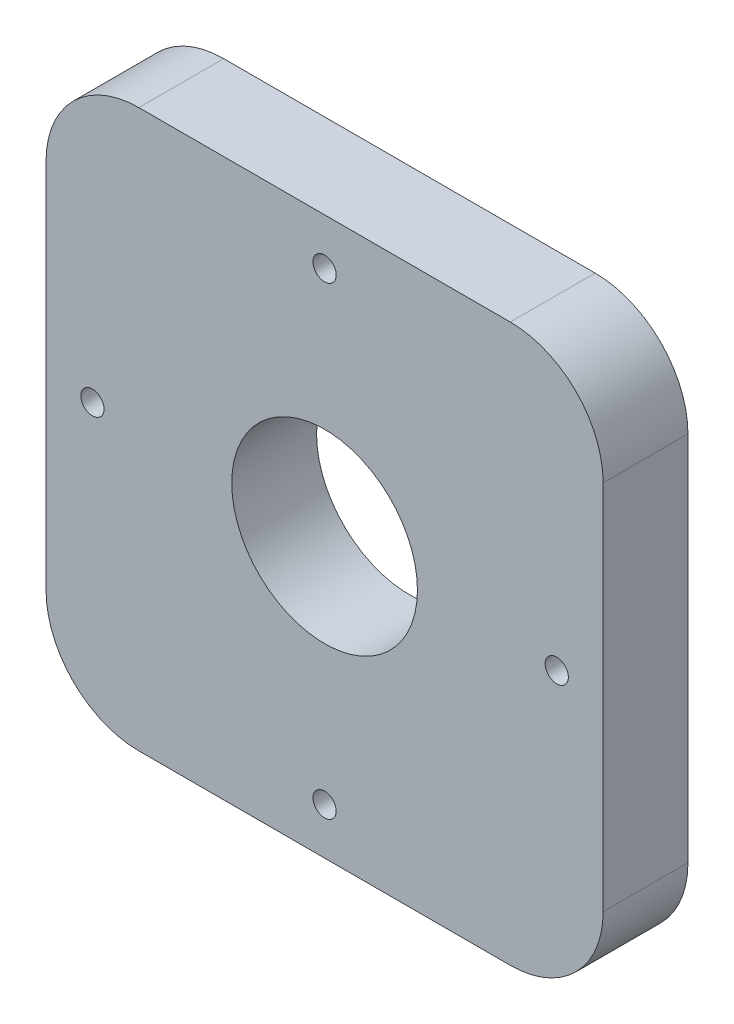
ISO-10303-21;
HEADER;
FILE_DESCRIPTION(('STEP AP214'),'2;1');
FILE_NAME('part.step','',(''),(''),'','','');
FILE_SCHEMA(('AUTOMOTIVE_DESIGN { 1 0 10303 214 1 1 1 1 }'));
ENDSEC;
DATA;
#1=APPLICATION_CONTEXT('core data for automotive mechanical design processes');
#2=APPLICATION_PROTOCOL_DEFINITION('international standard','automotive_design',2000,#1);
#3=PRODUCT_CONTEXT('',#1,'mechanical');
#4=PRODUCT('Part','Part','',(#3));
#5=PRODUCT_RELATED_PRODUCT_CATEGORY('part','',(#4));
#6=PRODUCT_DEFINITION_FORMATION('','',#4);
#7=PRODUCT_DEFINITION_CONTEXT('part definition',#1,'design');
#8=PRODUCT_DEFINITION('design','',#6,#7);
#9=PRODUCT_DEFINITION_SHAPE('','',#8);
#10=(LENGTH_UNIT() NAMED_UNIT(*) SI_UNIT(.MILLI.,.METRE.));
#11=(NAMED_UNIT(*) PLANE_ANGLE_UNIT() SI_UNIT($,.RADIAN.));
#12=(NAMED_UNIT(*) SI_UNIT($,.STERADIAN.) SOLID_ANGLE_UNIT());
#13=UNCERTAINTY_MEASURE_WITH_UNIT(LENGTH_MEASURE(1.E-05),#10,'distance_accuracy_value','');
#14=(GEOMETRIC_REPRESENTATION_CONTEXT(3) GLOBAL_UNCERTAINTY_ASSIGNED_CONTEXT((#13)) GLOBAL_UNIT_ASSIGNED_CONTEXT((#10,
#11,#12)) REPRESENTATION_CONTEXT('',''));
#15=CARTESIAN_POINT('',(0.,0.,0.));
#16=DIRECTION('',(0.,0.,1.));
#17=DIRECTION('',(1.,0.,0.));
#18=AXIS2_PLACEMENT_3D('',#15,#16,#17);
#19=CARTESIAN_POINT('',(19.05,19.05,5.8));
#20=DIRECTION('',(-1.,0.,0.));
#21=DIRECTION('',(0.,0.,1.));
#22=AXIS2_PLACEMENT_3D('',#19,#20,#21);
#23=PLANE('',#22);
#24=DIRECTION('',(0.,1.,0.));
#25=VECTOR('',#24,1.);
#26=CARTESIAN_POINT('',(19.05,19.05,5.8));
#27=LINE('',#26,#25);
#28=CARTESIAN_POINT('',(19.05,-12.7,5.8));
#29=VERTEX_POINT('',#28);
#30=CARTESIAN_POINT('',(19.05,12.7,5.8));
#31=VERTEX_POINT('',#30);
#32=EDGE_CURVE('E117',#29,#31,#27,.T.);
#33=ORIENTED_EDGE('',*,*,#32,.F.);
#34=DIRECTION('',(0.,0.,-1.));
#35=VECTOR('',#34,1.);
#36=CARTESIAN_POINT('',(19.05,-12.7,5.8));
#37=LINE('',#36,#35);
#38=CARTESIAN_POINT('',(19.05,-12.7,0.));
#39=VERTEX_POINT('',#38);
#40=EDGE_CURVE('E102',#29,#39,#37,.T.);
#41=ORIENTED_EDGE('',*,*,#40,.T.);
#42=DIRECTION('',(0.,1.,0.));
#43=VECTOR('',#42,1.);
#44=CARTESIAN_POINT('',(19.05,19.05,0.));
#45=LINE('',#44,#43);
#46=CARTESIAN_POINT('',(19.05,12.7,0.));
#47=VERTEX_POINT('',#46);
#48=EDGE_CURVE('E114',#39,#47,#45,.T.);
#49=ORIENTED_EDGE('',*,*,#48,.T.);
#50=DIRECTION('',(0.,0.,-1.));
#51=VECTOR('',#50,1.);
#52=CARTESIAN_POINT('',(19.05,12.7,5.8));
#53=LINE('',#52,#51);
#54=EDGE_CURVE('E119',#47,#31,#53,.F.);
#55=ORIENTED_EDGE('',*,*,#54,.T.);
#56=EDGE_LOOP('',(#33,#41,#49,#55));
#57=FACE_BOUND('',#56,.T.);
#58=ADVANCED_FACE('F32',(#57),#23,.F.);
#59=CARTESIAN_POINT('',(19.05,19.05,5.8));
#60=DIRECTION('',(0.,-1.,0.));
#61=DIRECTION('',(0.,0.,-1.));
#62=AXIS2_PLACEMENT_3D('',#59,#60,#61);
#63=PLANE('',#62);
#64=DIRECTION('',(-1.,0.,0.));
#65=VECTOR('',#64,1.);
#66=CARTESIAN_POINT('',(19.05,19.05,0.));
#67=LINE('',#66,#65);
#68=CARTESIAN_POINT('',(12.7,19.05,0.));
#69=VERTEX_POINT('',#68);
#70=CARTESIAN_POINT('',(-12.7,19.05,0.));
#71=VERTEX_POINT('',#70);
#72=EDGE_CURVE('E123',#69,#71,#67,.T.);
#73=ORIENTED_EDGE('',*,*,#72,.T.);
#74=DIRECTION('',(0.,0.,-1.));
#75=VECTOR('',#74,1.);
#76=CARTESIAN_POINT('',(-12.7,19.05,5.8));
#77=LINE('',#76,#75);
#78=CARTESIAN_POINT('',(-12.7,19.05,5.8));
#79=VERTEX_POINT('',#78);
#80=EDGE_CURVE('E11',#71,#79,#77,.F.);
#81=ORIENTED_EDGE('',*,*,#80,.T.);
#82=DIRECTION('',(-1.,0.,0.));
#83=VECTOR('',#82,1.);
#84=CARTESIAN_POINT('',(19.05,19.05,5.8));
#85=LINE('',#84,#83);
#86=CARTESIAN_POINT('',(12.7,19.05,5.8));
#87=VERTEX_POINT('',#86);
#88=EDGE_CURVE('E168',#87,#79,#85,.T.);
#89=ORIENTED_EDGE('',*,*,#88,.F.);
#90=DIRECTION('',(0.,0.,-1.));
#91=VECTOR('',#90,1.);
#92=CARTESIAN_POINT('',(12.7,19.05,5.8));
#93=LINE('',#92,#91);
#94=EDGE_CURVE('E40',#87,#69,#93,.T.);
#95=ORIENTED_EDGE('',*,*,#94,.T.);
#96=EDGE_LOOP('',(#73,#81,#89,#95));
#97=FACE_BOUND('',#96,.T.);
#98=ADVANCED_FACE('F166',(#97),#63,.F.);
#99=CARTESIAN_POINT('',(-19.05,19.05,5.8));
#100=DIRECTION('',(1.,0.,0.));
#101=DIRECTION('',(0.,0.,-1.));
#102=AXIS2_PLACEMENT_3D('',#99,#100,#101);
#103=PLANE('',#102);
#104=DIRECTION('',(0.,-1.,0.));
#105=VECTOR('',#104,1.);
#106=CARTESIAN_POINT('',(-19.05,19.05,0.));
#107=LINE('',#106,#105);
#108=CARTESIAN_POINT('',(-19.05,12.7,0.));
#109=VERTEX_POINT('',#108);
#110=CARTESIAN_POINT('',(-19.05,-12.7,0.));
#111=VERTEX_POINT('',#110);
#112=EDGE_CURVE('E127',#109,#111,#107,.T.);
#113=ORIENTED_EDGE('',*,*,#112,.T.);
#114=DIRECTION('',(0.,0.,-1.));
#115=VECTOR('',#114,1.);
#116=CARTESIAN_POINT('',(-19.05,-12.7,5.8));
#117=LINE('',#116,#115);
#118=CARTESIAN_POINT('',(-19.05,-12.7,5.8));
#119=VERTEX_POINT('',#118);
#120=EDGE_CURVE('E47',#111,#119,#117,.F.);
#121=ORIENTED_EDGE('',*,*,#120,.T.);
#122=DIRECTION('',(0.,-1.,0.));
#123=VECTOR('',#122,1.);
#124=CARTESIAN_POINT('',(-19.05,19.05,5.8));
#125=LINE('',#124,#123);
#126=CARTESIAN_POINT('',(-19.05,12.7,5.8));
#127=VERTEX_POINT('',#126);
#128=EDGE_CURVE('E176',#127,#119,#125,.T.);
#129=ORIENTED_EDGE('',*,*,#128,.F.);
#130=DIRECTION('',(0.,0.,-1.));
#131=VECTOR('',#130,1.);
#132=CARTESIAN_POINT('',(-19.05,12.7,5.8));
#133=LINE('',#132,#131);
#134=EDGE_CURVE('E159',#127,#109,#133,.T.);
#135=ORIENTED_EDGE('',*,*,#134,.T.);
#136=EDGE_LOOP('',(#113,#121,#129,#135));
#137=FACE_BOUND('',#136,.T.);
#138=ADVANCED_FACE('F175',(#137),#103,.F.);
#139=CARTESIAN_POINT('',(19.05,-19.05,5.8));
#140=DIRECTION('',(0.,1.,0.));
#141=DIRECTION('',(0.,0.,1.));
#142=AXIS2_PLACEMENT_3D('',#139,#140,#141);
#143=PLANE('',#142);
#144=DIRECTION('',(1.,0.,0.));
#145=VECTOR('',#144,1.);
#146=CARTESIAN_POINT('',(19.05,-19.05,0.));
#147=LINE('',#146,#145);
#148=CARTESIAN_POINT('',(-12.7,-19.05,0.));
#149=VERTEX_POINT('',#148);
#150=CARTESIAN_POINT('',(12.7,-19.05,0.));
#151=VERTEX_POINT('',#150);
#152=EDGE_CURVE('E137',#149,#151,#147,.T.);
#153=ORIENTED_EDGE('',*,*,#152,.T.);
#154=DIRECTION('',(0.,0.,-1.));
#155=VECTOR('',#154,1.);
#156=CARTESIAN_POINT('',(12.7,-19.05,5.8));
#157=LINE('',#156,#155);
#158=CARTESIAN_POINT('',(12.7,-19.05,5.8));
#159=VERTEX_POINT('',#158);
#160=EDGE_CURVE('E103',#151,#159,#157,.F.);
#161=ORIENTED_EDGE('',*,*,#160,.T.);
#162=DIRECTION('',(1.,0.,0.));
#163=VECTOR('',#162,1.);
#164=CARTESIAN_POINT('',(19.05,-19.05,5.8));
#165=LINE('',#164,#163);
#166=CARTESIAN_POINT('',(-12.7,-19.05,5.8));
#167=VERTEX_POINT('',#166);
#168=EDGE_CURVE('E133',#167,#159,#165,.T.);
#169=ORIENTED_EDGE('',*,*,#168,.F.);
#170=DIRECTION('',(0.,0.,-1.));
#171=VECTOR('',#170,1.);
#172=CARTESIAN_POINT('',(-12.7,-19.05,5.8));
#173=LINE('',#172,#171);
#174=EDGE_CURVE('E108',#167,#149,#173,.T.);
#175=ORIENTED_EDGE('',*,*,#174,.T.);
#176=EDGE_LOOP('',(#153,#161,#169,#175));
#177=FACE_BOUND('',#176,.T.);
#178=ADVANCED_FACE('F209',(#177),#143,.F.);
#179=CARTESIAN_POINT('',(19.05,-19.05,5.8));
#180=DIRECTION('',(0.,0.,-1.));
#181=DIRECTION('',(-1.,0.,0.));
#182=AXIS2_PLACEMENT_3D('',#179,#180,#181);
#183=PLANE('',#182);
#184=CARTESIAN_POINT('',(0.,0.,5.8));
#185=DIRECTION('',(0.,0.,1.));
#186=DIRECTION('',(1.,0.,0.));
#187=AXIS2_PLACEMENT_3D('',#184,#185,#186);
#188=CIRCLE('',#187,6.35);
#189=CARTESIAN_POINT('',(6.35,0.,5.8));
#190=VERTEX_POINT('',#189);
#191=EDGE_CURVE('E143',#190,#190,#188,.T.);
#192=ORIENTED_EDGE('',*,*,#191,.F.);
#193=EDGE_LOOP('',(#192));
#194=FACE_BOUND('',#193,.T.);
#195=CARTESIAN_POINT('',(-15.8749999999998,-2.21709065016539E-13,5.8));
#196=DIRECTION('',(0.,0.,1.));
#197=DIRECTION('',(1.,0.,0.));
#198=AXIS2_PLACEMENT_3D('',#195,#196,#197);
#199=CIRCLE('',#198,0.793749999999999);
#200=CARTESIAN_POINT('',(-15.0812499999998,-2.21709065016539E-13,5.8));
#201=VERTEX_POINT('',#200);
#202=EDGE_CURVE('E142',#201,#201,#199,.T.);
#203=ORIENTED_EDGE('',*,*,#202,.F.);
#204=EDGE_LOOP('',(#203));
#205=FACE_BOUND('',#204,.T.);
#206=CARTESIAN_POINT('',(0.,-15.875,5.8));
#207=DIRECTION('',(0.,0.,1.));
#208=DIRECTION('',(1.,0.,0.));
#209=AXIS2_PLACEMENT_3D('',#206,#207,#208);
#210=CIRCLE('',#209,0.793750000000494);
#211=CARTESIAN_POINT('',(0.79375000000044,-15.875,5.8));
#212=VERTEX_POINT('',#211);
#213=EDGE_CURVE('E191',#212,#212,#210,.T.);
#214=ORIENTED_EDGE('',*,*,#213,.F.);
#215=EDGE_LOOP('',(#214));
#216=FACE_BOUND('',#215,.T.);
#217=CARTESIAN_POINT('',(15.875,0.,5.8));
#218=DIRECTION('',(0.,0.,1.));
#219=DIRECTION('',(1.,0.,0.));
#220=AXIS2_PLACEMENT_3D('',#217,#218,#219);
#221=CIRCLE('',#220,0.793749999999999);
#222=CARTESIAN_POINT('',(16.66875,0.,5.8));
#223=VERTEX_POINT('',#222);
#224=EDGE_CURVE('E185',#223,#223,#221,.T.);
#225=ORIENTED_EDGE('',*,*,#224,.F.);
#226=EDGE_LOOP('',(#225));
#227=FACE_BOUND('',#226,.T.);
#228=CARTESIAN_POINT('',(0.,15.875,5.8));
#229=DIRECTION('',(0.,0.,1.));
#230=DIRECTION('',(1.,0.,0.));
#231=AXIS2_PLACEMENT_3D('',#228,#229,#230);
#232=CIRCLE('',#231,0.79375);
#233=CARTESIAN_POINT('',(0.79375,15.875,5.8));
#234=VERTEX_POINT('',#233);
#235=EDGE_CURVE('E130',#234,#234,#232,.T.);
#236=ORIENTED_EDGE('',*,*,#235,.F.);
#237=EDGE_LOOP('',(#236));
#238=FACE_BOUND('',#237,.T.);
#239=ORIENTED_EDGE('',*,*,#168,.T.);
#240=CARTESIAN_POINT('',(12.7,-12.7,5.8));
#241=DIRECTION('',(0.,0.,-1.));
#242=DIRECTION('',(-1.,0.,0.));
#243=AXIS2_PLACEMENT_3D('',#240,#241,#242);
#244=CIRCLE('',#243,6.35);
#245=EDGE_CURVE('E157',#159,#29,#244,.F.);
#246=ORIENTED_EDGE('',*,*,#245,.T.);
#247=ORIENTED_EDGE('',*,*,#32,.T.);
#248=CARTESIAN_POINT('',(12.7,12.7,5.8));
#249=DIRECTION('',(0.,0.,-1.));
#250=DIRECTION('',(-1.,0.,0.));
#251=AXIS2_PLACEMENT_3D('',#248,#249,#250);
#252=CIRCLE('',#251,6.35);
#253=EDGE_CURVE('E152',#31,#87,#252,.F.);
#254=ORIENTED_EDGE('',*,*,#253,.T.);
#255=ORIENTED_EDGE('',*,*,#88,.T.);
#256=CARTESIAN_POINT('',(-12.7,12.7,5.8));
#257=DIRECTION('',(0.,0.,-1.));
#258=DIRECTION('',(-1.,0.,0.));
#259=AXIS2_PLACEMENT_3D('',#256,#257,#258);
#260=CIRCLE('',#259,6.35);
#261=EDGE_CURVE('E54',#79,#127,#260,.F.);
#262=ORIENTED_EDGE('',*,*,#261,.T.);
#263=ORIENTED_EDGE('',*,*,#128,.T.);
#264=CARTESIAN_POINT('',(-12.7,-12.7,5.8));
#265=DIRECTION('',(0.,0.,-1.));
#266=DIRECTION('',(-1.,0.,0.));
#267=AXIS2_PLACEMENT_3D('',#264,#265,#266);
#268=CIRCLE('',#267,6.35);
#269=EDGE_CURVE('E155',#119,#167,#268,.F.);
#270=ORIENTED_EDGE('',*,*,#269,.T.);
#271=EDGE_LOOP('',(#239,#246,#247,#254,#255,#262,#263,#270));
#272=FACE_BOUND('',#271,.T.);
#273=ADVANCED_FACE('F206',(#194,#205,#216,#227,#238,#272),#183,.F.);
#274=CARTESIAN_POINT('',(19.05,-19.05,0.));
#275=DIRECTION('',(0.,0.,-1.));
#276=DIRECTION('',(-1.,0.,0.));
#277=AXIS2_PLACEMENT_3D('',#274,#275,#276);
#278=PLANE('',#277);
#279=CARTESIAN_POINT('',(0.,0.,0.));
#280=DIRECTION('',(0.,0.,-1.));
#281=DIRECTION('',(-1.,0.,0.));
#282=AXIS2_PLACEMENT_3D('',#279,#280,#281);
#283=CIRCLE('',#282,6.35);
#284=CARTESIAN_POINT('',(-6.35,0.,0.));
#285=VERTEX_POINT('',#284);
#286=EDGE_CURVE('E139',#285,#285,#283,.T.);
#287=ORIENTED_EDGE('',*,*,#286,.F.);
#288=EDGE_LOOP('',(#287));
#289=FACE_BOUND('',#288,.T.);
#290=CARTESIAN_POINT('',(-15.8749999999998,-2.21709065016539E-13,0.));
#291=DIRECTION('',(0.,0.,1.));
#292=DIRECTION('',(1.,0.,0.));
#293=AXIS2_PLACEMENT_3D('',#290,#291,#292);
#294=CIRCLE('',#293,0.793749999999999);
#295=CARTESIAN_POINT('',(-15.0812499999998,-2.21709065016539E-13,0.));
#296=VERTEX_POINT('',#295);
#297=EDGE_CURVE('E194',#296,#296,#294,.T.);
#298=ORIENTED_EDGE('',*,*,#297,.T.);
#299=EDGE_LOOP('',(#298));
#300=FACE_BOUND('',#299,.T.);
#301=CARTESIAN_POINT('',(0.,-15.875,0.));
#302=DIRECTION('',(0.,0.,1.));
#303=DIRECTION('',(1.,0.,0.));
#304=AXIS2_PLACEMENT_3D('',#301,#302,#303);
#305=CIRCLE('',#304,0.793750000000494);
#306=CARTESIAN_POINT('',(0.79375000000044,-15.875,0.));
#307=VERTEX_POINT('',#306);
#308=EDGE_CURVE('E188',#307,#307,#305,.T.);
#309=ORIENTED_EDGE('',*,*,#308,.T.);
#310=EDGE_LOOP('',(#309));
#311=FACE_BOUND('',#310,.T.);
#312=CARTESIAN_POINT('',(15.875,0.,0.));
#313=DIRECTION('',(0.,0.,1.));
#314=DIRECTION('',(1.,0.,0.));
#315=AXIS2_PLACEMENT_3D('',#312,#313,#314);
#316=CIRCLE('',#315,0.793749999999999);
#317=CARTESIAN_POINT('',(16.66875,0.,0.));
#318=VERTEX_POINT('',#317);
#319=EDGE_CURVE('E183',#318,#318,#316,.T.);
#320=ORIENTED_EDGE('',*,*,#319,.T.);
#321=EDGE_LOOP('',(#320));
#322=FACE_BOUND('',#321,.T.);
#323=CARTESIAN_POINT('',(0.,15.875,0.));
#324=DIRECTION('',(0.,0.,1.));
#325=DIRECTION('',(1.,0.,0.));
#326=AXIS2_PLACEMENT_3D('',#323,#324,#325);
#327=CIRCLE('',#326,0.79375);
#328=CARTESIAN_POINT('',(0.79375,15.875,0.));
#329=VERTEX_POINT('',#328);
#330=EDGE_CURVE('E124',#329,#329,#327,.T.);
#331=ORIENTED_EDGE('',*,*,#330,.T.);
#332=EDGE_LOOP('',(#331));
#333=FACE_BOUND('',#332,.T.);
#334=ORIENTED_EDGE('',*,*,#48,.F.);
#335=CARTESIAN_POINT('',(12.7,-12.7,0.));
#336=DIRECTION('',(0.,0.,-1.));
#337=DIRECTION('',(-1.,0.,0.));
#338=AXIS2_PLACEMENT_3D('',#335,#336,#337);
#339=CIRCLE('',#338,6.35);
#340=EDGE_CURVE('E98',#39,#151,#339,.T.);
#341=ORIENTED_EDGE('',*,*,#340,.T.);
#342=ORIENTED_EDGE('',*,*,#152,.F.);
#343=CARTESIAN_POINT('',(-12.7,-12.7,0.));
#344=DIRECTION('',(0.,0.,-1.));
#345=DIRECTION('',(-1.,0.,0.));
#346=AXIS2_PLACEMENT_3D('',#343,#344,#345);
#347=CIRCLE('',#346,6.35);
#348=EDGE_CURVE('E109',#149,#111,#347,.T.);
#349=ORIENTED_EDGE('',*,*,#348,.T.);
#350=ORIENTED_EDGE('',*,*,#112,.F.);
#351=CARTESIAN_POINT('',(-12.7,12.7,0.));
#352=DIRECTION('',(0.,0.,-1.));
#353=DIRECTION('',(-1.,0.,0.));
#354=AXIS2_PLACEMENT_3D('',#351,#352,#353);
#355=CIRCLE('',#354,6.35);
#356=EDGE_CURVE('E146',#109,#71,#355,.T.);
#357=ORIENTED_EDGE('',*,*,#356,.T.);
#358=ORIENTED_EDGE('',*,*,#72,.F.);
#359=CARTESIAN_POINT('',(12.7,12.7,0.));
#360=DIRECTION('',(0.,0.,-1.));
#361=DIRECTION('',(-1.,0.,0.));
#362=AXIS2_PLACEMENT_3D('',#359,#360,#361);
#363=CIRCLE('',#362,6.35);
#364=EDGE_CURVE('E118',#69,#47,#363,.T.);
#365=ORIENTED_EDGE('',*,*,#364,.T.);
#366=EDGE_LOOP('',(#334,#341,#342,#349,#350,#357,#358,#365));
#367=FACE_BOUND('',#366,.T.);
#368=ADVANCED_FACE('F121',(#289,#300,#311,#322,#333,#367),#278,.T.);
#369=CARTESIAN_POINT('',(0.,15.875,0.));
#370=DIRECTION('',(0.,0.,1.));
#371=DIRECTION('',(1.,0.,0.));
#372=AXIS2_PLACEMENT_3D('',#369,#370,#371);
#373=CYLINDRICAL_SURFACE('',#372,0.79375);
#374=ORIENTED_EDGE('',*,*,#330,.F.);
#375=EDGE_LOOP('',(#374));
#376=FACE_BOUND('',#375,.T.);
#377=ORIENTED_EDGE('',*,*,#235,.T.);
#378=EDGE_LOOP('',(#377));
#379=FACE_BOUND('',#378,.T.);
#380=ADVANCED_FACE('F242',(#376,#379),#373,.F.);
#381=CARTESIAN_POINT('',(15.875,0.,0.));
#382=DIRECTION('',(0.,0.,1.));
#383=DIRECTION('',(1.,0.,0.));
#384=AXIS2_PLACEMENT_3D('',#381,#382,#383);
#385=CYLINDRICAL_SURFACE('',#384,0.793749999999999);
#386=ORIENTED_EDGE('',*,*,#319,.F.);
#387=EDGE_LOOP('',(#386));
#388=FACE_BOUND('',#387,.T.);
#389=ORIENTED_EDGE('',*,*,#224,.T.);
#390=EDGE_LOOP('',(#389));
#391=FACE_BOUND('',#390,.T.);
#392=ADVANCED_FACE('F247',(#388,#391),#385,.F.);
#393=CARTESIAN_POINT('',(0.,-15.875,0.));
#394=DIRECTION('',(0.,0.,1.));
#395=DIRECTION('',(1.,0.,0.));
#396=AXIS2_PLACEMENT_3D('',#393,#394,#395);
#397=CYLINDRICAL_SURFACE('',#396,0.793750000000494);
#398=ORIENTED_EDGE('',*,*,#308,.F.);
#399=EDGE_LOOP('',(#398));
#400=FACE_BOUND('',#399,.T.);
#401=ORIENTED_EDGE('',*,*,#213,.T.);
#402=EDGE_LOOP('',(#401));
#403=FACE_BOUND('',#402,.T.);
#404=ADVANCED_FACE('F251',(#400,#403),#397,.F.);
#405=CARTESIAN_POINT('',(-15.8749999999998,-2.21709065016539E-13,0.));
#406=DIRECTION('',(0.,0.,1.));
#407=DIRECTION('',(1.,0.,0.));
#408=AXIS2_PLACEMENT_3D('',#405,#406,#407);
#409=CYLINDRICAL_SURFACE('',#408,0.793749999999999);
#410=ORIENTED_EDGE('',*,*,#297,.F.);
#411=EDGE_LOOP('',(#410));
#412=FACE_BOUND('',#411,.T.);
#413=ORIENTED_EDGE('',*,*,#202,.T.);
#414=EDGE_LOOP('',(#413));
#415=FACE_BOUND('',#414,.T.);
#416=ADVANCED_FACE('F255',(#412,#415),#409,.F.);
#417=CARTESIAN_POINT('',(0.,0.,-6.9));
#418=DIRECTION('',(0.,0.,1.));
#419=DIRECTION('',(1.,0.,0.));
#420=AXIS2_PLACEMENT_3D('',#417,#418,#419);
#421=CYLINDRICAL_SURFACE('',#420,6.35);
#422=ORIENTED_EDGE('',*,*,#286,.T.);
#423=EDGE_LOOP('',(#422));
#424=FACE_BOUND('',#423,.T.);
#425=ORIENTED_EDGE('',*,*,#191,.T.);
#426=EDGE_LOOP('',(#425));
#427=FACE_BOUND('',#426,.T.);
#428=ADVANCED_FACE('F204',(#424,#427),#421,.F.);
#429=CARTESIAN_POINT('',(12.7,-12.7,5.8));
#430=DIRECTION('',(0.,0.,-1.));
#431=DIRECTION('',(-1.,0.,0.));
#432=AXIS2_PLACEMENT_3D('',#429,#430,#431);
#433=CYLINDRICAL_SURFACE('',#432,6.35);
#434=ORIENTED_EDGE('',*,*,#245,.F.);
#435=ORIENTED_EDGE('',*,*,#160,.F.);
#436=ORIENTED_EDGE('',*,*,#340,.F.);
#437=ORIENTED_EDGE('',*,*,#40,.F.);
#438=EDGE_LOOP('',(#434,#435,#436,#437));
#439=FACE_BOUND('',#438,.T.);
#440=ADVANCED_FACE('F101',(#439),#433,.T.);
#441=CARTESIAN_POINT('',(-12.7,-12.7,5.8));
#442=DIRECTION('',(0.,0.,-1.));
#443=DIRECTION('',(-1.,0.,0.));
#444=AXIS2_PLACEMENT_3D('',#441,#442,#443);
#445=CYLINDRICAL_SURFACE('',#444,6.35);
#446=ORIENTED_EDGE('',*,*,#269,.F.);
#447=ORIENTED_EDGE('',*,*,#120,.F.);
#448=ORIENTED_EDGE('',*,*,#348,.F.);
#449=ORIENTED_EDGE('',*,*,#174,.F.);
#450=EDGE_LOOP('',(#446,#447,#448,#449));
#451=FACE_BOUND('',#450,.T.);
#452=ADVANCED_FACE('F222',(#451),#445,.T.);
#453=CARTESIAN_POINT('',(-12.7,12.7,5.8));
#454=DIRECTION('',(0.,0.,-1.));
#455=DIRECTION('',(-1.,0.,0.));
#456=AXIS2_PLACEMENT_3D('',#453,#454,#455);
#457=CYLINDRICAL_SURFACE('',#456,6.35);
#458=ORIENTED_EDGE('',*,*,#261,.F.);
#459=ORIENTED_EDGE('',*,*,#80,.F.);
#460=ORIENTED_EDGE('',*,*,#356,.F.);
#461=ORIENTED_EDGE('',*,*,#134,.F.);
#462=EDGE_LOOP('',(#458,#459,#460,#461));
#463=FACE_BOUND('',#462,.T.);
#464=ADVANCED_FACE('F174',(#463),#457,.T.);
#465=CARTESIAN_POINT('',(12.7,12.7,5.8));
#466=DIRECTION('',(0.,0.,-1.));
#467=DIRECTION('',(-1.,0.,0.));
#468=AXIS2_PLACEMENT_3D('',#465,#466,#467);
#469=CYLINDRICAL_SURFACE('',#468,6.35);
#470=ORIENTED_EDGE('',*,*,#253,.F.);
#471=ORIENTED_EDGE('',*,*,#54,.F.);
#472=ORIENTED_EDGE('',*,*,#364,.F.);
#473=ORIENTED_EDGE('',*,*,#94,.F.);
#474=EDGE_LOOP('',(#470,#471,#472,#473));
#475=FACE_BOUND('',#474,.T.);
#476=ADVANCED_FACE('F34',(#475),#469,.T.);
#477=CLOSED_SHELL('',(#58,#98,#138,#178,#273,#368,#380,#392,#404,#416,#428,#440,#452,#464,#476));
#478=MANIFOLD_SOLID_BREP('B2',#477);
#479=ADVANCED_BREP_SHAPE_REPRESENTATION('',(#18,#478),#14);
#480=SHAPE_DEFINITION_REPRESENTATION(#9,#479);
ENDSEC;
END-ISO-10303-21;
